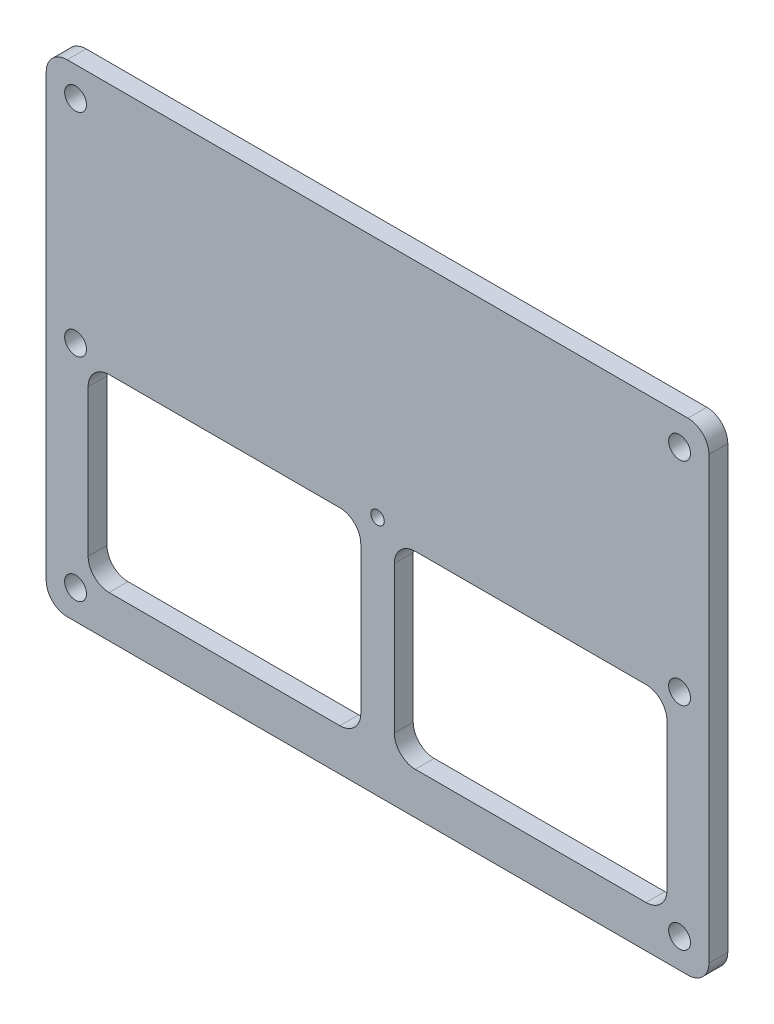
ISO-10303-21;
HEADER;
FILE_DESCRIPTION(('STEP AP214'),'2;1');
FILE_NAME('part.step','',(''),(''),'','','');
FILE_SCHEMA(('AUTOMOTIVE_DESIGN { 1 0 10303 214 1 1 1 1 }'));
ENDSEC;
DATA;
#1=APPLICATION_CONTEXT('core data for automotive mechanical design processes');
#2=APPLICATION_PROTOCOL_DEFINITION('international standard','automotive_design',2000,#1);
#3=PRODUCT_CONTEXT('',#1,'mechanical');
#4=PRODUCT('Part','Part','',(#3));
#5=PRODUCT_RELATED_PRODUCT_CATEGORY('part','',(#4));
#6=PRODUCT_DEFINITION_FORMATION('','',#4);
#7=PRODUCT_DEFINITION_CONTEXT('part definition',#1,'design');
#8=PRODUCT_DEFINITION('design','',#6,#7);
#9=PRODUCT_DEFINITION_SHAPE('','',#8);
#10=(LENGTH_UNIT() NAMED_UNIT(*) SI_UNIT(.MILLI.,.METRE.));
#11=(NAMED_UNIT(*) PLANE_ANGLE_UNIT() SI_UNIT($,.RADIAN.));
#12=(NAMED_UNIT(*) SI_UNIT($,.STERADIAN.) SOLID_ANGLE_UNIT());
#13=UNCERTAINTY_MEASURE_WITH_UNIT(LENGTH_MEASURE(1.E-05),#10,'distance_accuracy_value','');
#14=(GEOMETRIC_REPRESENTATION_CONTEXT(3) GLOBAL_UNCERTAINTY_ASSIGNED_CONTEXT((#13)) GLOBAL_UNIT_ASSIGNED_CONTEXT((#10,
#11,#12)) REPRESENTATION_CONTEXT('',''));
#15=CARTESIAN_POINT('',(0.,0.,0.));
#16=DIRECTION('',(0.,0.,1.));
#17=DIRECTION('',(1.,0.,0.));
#18=AXIS2_PLACEMENT_3D('',#15,#16,#17);
#19=CARTESIAN_POINT('',(-79.,-57.5,4.5));
#20=DIRECTION('',(1.,0.,0.));
#21=DIRECTION('',(0.,0.,-1.));
#22=AXIS2_PLACEMENT_3D('',#19,#20,#21);
#23=PLANE('',#22);
#24=DIRECTION('',(0.,-1.,0.));
#25=VECTOR('',#24,1.);
#26=CARTESIAN_POINT('',(-79.,-57.5,0.));
#27=LINE('',#26,#25);
#28=CARTESIAN_POINT('',(-79.,52.5,0.));
#29=VERTEX_POINT('',#28);
#30=CARTESIAN_POINT('',(-79.,-52.5,0.));
#31=VERTEX_POINT('',#30);
#32=EDGE_CURVE('E346',#29,#31,#27,.T.);
#33=ORIENTED_EDGE('',*,*,#32,.T.);
#34=DIRECTION('',(0.,0.,-1.));
#35=VECTOR('',#34,1.);
#36=CARTESIAN_POINT('',(-79.,-52.5,4.5));
#37=LINE('',#36,#35);
#38=CARTESIAN_POINT('',(-79.,-52.5,4.5));
#39=VERTEX_POINT('',#38);
#40=EDGE_CURVE('E409',#31,#39,#37,.F.);
#41=ORIENTED_EDGE('',*,*,#40,.T.);
#42=DIRECTION('',(0.,-1.,0.));
#43=VECTOR('',#42,1.);
#44=CARTESIAN_POINT('',(-79.,-57.5,4.5));
#45=LINE('',#44,#43);
#46=CARTESIAN_POINT('',(-79.,52.5,4.5));
#47=VERTEX_POINT('',#46);
#48=EDGE_CURVE('E361',#47,#39,#45,.T.);
#49=ORIENTED_EDGE('',*,*,#48,.F.);
#50=DIRECTION('',(0.,0.,-1.));
#51=VECTOR('',#50,1.);
#52=CARTESIAN_POINT('',(-79.,52.5,4.5));
#53=LINE('',#52,#51);
#54=EDGE_CURVE('E406',#47,#29,#53,.T.);
#55=ORIENTED_EDGE('',*,*,#54,.T.);
#56=EDGE_LOOP('',(#33,#41,#49,#55));
#57=FACE_BOUND('',#56,.T.);
#58=ADVANCED_FACE('F37',(#57),#23,.F.);
#59=CARTESIAN_POINT('',(79.,-57.5,4.5));
#60=DIRECTION('',(0.,1.,0.));
#61=DIRECTION('',(-1.,0.,0.));
#62=AXIS2_PLACEMENT_3D('',#59,#60,#61);
#63=PLANE('',#62);
#64=DIRECTION('',(1.,0.,0.));
#65=VECTOR('',#64,1.);
#66=CARTESIAN_POINT('',(79.,-57.5,0.));
#67=LINE('',#66,#65);
#68=CARTESIAN_POINT('',(-74.,-57.5,0.));
#69=VERTEX_POINT('',#68);
#70=CARTESIAN_POINT('',(74.,-57.5,0.));
#71=VERTEX_POINT('',#70);
#72=EDGE_CURVE('E375',#69,#71,#67,.T.);
#73=ORIENTED_EDGE('',*,*,#72,.T.);
#74=DIRECTION('',(0.,0.,-1.));
#75=VECTOR('',#74,1.);
#76=CARTESIAN_POINT('',(74.,-57.5,4.5));
#77=LINE('',#76,#75);
#78=CARTESIAN_POINT('',(74.,-57.5,4.5));
#79=VERTEX_POINT('',#78);
#80=EDGE_CURVE('E397',#71,#79,#77,.F.);
#81=ORIENTED_EDGE('',*,*,#80,.T.);
#82=DIRECTION('',(1.,0.,0.));
#83=VECTOR('',#82,1.);
#84=CARTESIAN_POINT('',(79.,-57.5,4.5));
#85=LINE('',#84,#83);
#86=CARTESIAN_POINT('',(-74.,-57.5,4.5));
#87=VERTEX_POINT('',#86);
#88=EDGE_CURVE('E364',#87,#79,#85,.T.);
#89=ORIENTED_EDGE('',*,*,#88,.F.);
#90=DIRECTION('',(0.,0.,-1.));
#91=VECTOR('',#90,1.);
#92=CARTESIAN_POINT('',(-74.,-57.5,4.5));
#93=LINE('',#92,#91);
#94=EDGE_CURVE('E394',#87,#69,#93,.T.);
#95=ORIENTED_EDGE('',*,*,#94,.T.);
#96=EDGE_LOOP('',(#73,#81,#89,#95));
#97=FACE_BOUND('',#96,.T.);
#98=ADVANCED_FACE('F424',(#97),#63,.F.);
#99=CARTESIAN_POINT('',(79.,-57.5,4.5));
#100=DIRECTION('',(-1.,0.,0.));
#101=DIRECTION('',(0.,0.,1.));
#102=AXIS2_PLACEMENT_3D('',#99,#100,#101);
#103=PLANE('',#102);
#104=DIRECTION('',(0.,1.,0.));
#105=VECTOR('',#104,1.);
#106=CARTESIAN_POINT('',(79.,-57.5,4.5));
#107=LINE('',#106,#105);
#108=CARTESIAN_POINT('',(79.,-52.5,4.5));
#109=VERTEX_POINT('',#108);
#110=CARTESIAN_POINT('',(79.,52.5,4.5));
#111=VERTEX_POINT('',#110);
#112=EDGE_CURVE('E368',#109,#111,#107,.T.);
#113=ORIENTED_EDGE('',*,*,#112,.F.);
#114=DIRECTION('',(0.,0.,-1.));
#115=VECTOR('',#114,1.);
#116=CARTESIAN_POINT('',(79.,-52.5,4.5));
#117=LINE('',#116,#115);
#118=CARTESIAN_POINT('',(79.,-52.5,0.));
#119=VERTEX_POINT('',#118);
#120=EDGE_CURVE('E383',#109,#119,#117,.T.);
#121=ORIENTED_EDGE('',*,*,#120,.T.);
#122=DIRECTION('',(0.,1.,0.));
#123=VECTOR('',#122,1.);
#124=CARTESIAN_POINT('',(79.,-57.5,0.));
#125=LINE('',#124,#123);
#126=CARTESIAN_POINT('',(79.,52.5,0.));
#127=VERTEX_POINT('',#126);
#128=EDGE_CURVE('E378',#119,#127,#125,.T.);
#129=ORIENTED_EDGE('',*,*,#128,.T.);
#130=DIRECTION('',(0.,0.,-1.));
#131=VECTOR('',#130,1.);
#132=CARTESIAN_POINT('',(79.,52.5,4.5));
#133=LINE('',#132,#131);
#134=EDGE_CURVE('E372',#127,#111,#133,.F.);
#135=ORIENTED_EDGE('',*,*,#134,.T.);
#136=EDGE_LOOP('',(#113,#121,#129,#135));
#137=FACE_BOUND('',#136,.T.);
#138=ADVANCED_FACE('F434',(#137),#103,.F.);
#139=CARTESIAN_POINT('',(79.,57.5,4.5));
#140=DIRECTION('',(0.,-1.,0.));
#141=DIRECTION('',(1.,0.,0.));
#142=AXIS2_PLACEMENT_3D('',#139,#140,#141);
#143=PLANE('',#142);
#144=DIRECTION('',(-1.,0.,0.));
#145=VECTOR('',#144,1.);
#146=CARTESIAN_POINT('',(79.,57.5,4.5));
#147=LINE('',#146,#145);
#148=CARTESIAN_POINT('',(74.,57.5,4.5));
#149=VERTEX_POINT('',#148);
#150=CARTESIAN_POINT('',(-74.,57.5,4.5));
#151=VERTEX_POINT('',#150);
#152=EDGE_CURVE('E370',#149,#151,#147,.T.);
#153=ORIENTED_EDGE('',*,*,#152,.F.);
#154=DIRECTION('',(0.,0.,-1.));
#155=VECTOR('',#154,1.);
#156=CARTESIAN_POINT('',(74.,57.5,4.5));
#157=LINE('',#156,#155);
#158=CARTESIAN_POINT('',(74.,57.5,0.));
#159=VERTEX_POINT('',#158);
#160=EDGE_CURVE('E11',#149,#159,#157,.T.);
#161=ORIENTED_EDGE('',*,*,#160,.T.);
#162=DIRECTION('',(-1.,0.,0.));
#163=VECTOR('',#162,1.);
#164=CARTESIAN_POINT('',(79.,57.5,0.));
#165=LINE('',#164,#163);
#166=CARTESIAN_POINT('',(-74.,57.5,0.));
#167=VERTEX_POINT('',#166);
#168=EDGE_CURVE('E365',#159,#167,#165,.T.);
#169=ORIENTED_EDGE('',*,*,#168,.T.);
#170=DIRECTION('',(0.,0.,-1.));
#171=VECTOR('',#170,1.);
#172=CARTESIAN_POINT('',(-74.,57.5,4.5));
#173=LINE('',#172,#171);
#174=EDGE_CURVE('E45',#167,#151,#173,.F.);
#175=ORIENTED_EDGE('',*,*,#174,.T.);
#176=EDGE_LOOP('',(#153,#161,#169,#175));
#177=FACE_BOUND('',#176,.T.);
#178=ADVANCED_FACE('F440',(#177),#143,.F.);
#179=CARTESIAN_POINT('',(0.,0.,4.5));
#180=DIRECTION('',(0.,0.,1.));
#181=DIRECTION('',(1.,0.,0.));
#182=AXIS2_PLACEMENT_3D('',#179,#180,#181);
#183=PLANE('',#182);
#184=CARTESIAN_POINT('',(64.,-7.49999999999999,4.5));
#185=DIRECTION('',(0.,0.,1.));
#186=DIRECTION('',(-1.,0.,0.));
#187=AXIS2_PLACEMENT_3D('',#184,#185,#186);
#188=CIRCLE('',#187,5.);
#189=CARTESIAN_POINT('',(69.,-7.49999999999999,4.5));
#190=VERTEX_POINT('',#189);
#191=CARTESIAN_POINT('',(64.,-2.49999999999999,4.5));
#192=VERTEX_POINT('',#191);
#193=EDGE_CURVE('E206',#190,#192,#188,.T.);
#194=ORIENTED_EDGE('',*,*,#193,.F.);
#195=DIRECTION('',(0.,1.,0.));
#196=VECTOR('',#195,1.);
#197=CARTESIAN_POINT('',(69.,-7.49999999999999,4.5));
#198=LINE('',#197,#196);
#199=CARTESIAN_POINT('',(69.,-42.5,4.5));
#200=VERTEX_POINT('',#199);
#201=EDGE_CURVE('E225',#200,#190,#198,.T.);
#202=ORIENTED_EDGE('',*,*,#201,.F.);
#203=CARTESIAN_POINT('',(64.,-42.5,4.5));
#204=DIRECTION('',(0.,0.,1.));
#205=DIRECTION('',(-1.,0.,0.));
#206=AXIS2_PLACEMENT_3D('',#203,#204,#205);
#207=CIRCLE('',#206,5.00000000000001);
#208=CARTESIAN_POINT('',(64.,-47.5,4.5));
#209=VERTEX_POINT('',#208);
#210=EDGE_CURVE('E228',#209,#200,#207,.T.);
#211=ORIENTED_EDGE('',*,*,#210,.F.);
#212=DIRECTION('',(1.,0.,0.));
#213=VECTOR('',#212,1.);
#214=CARTESIAN_POINT('',(64.,-47.5,4.5));
#215=LINE('',#214,#213);
#216=CARTESIAN_POINT('',(9.00000000000006,-47.5,4.5));
#217=VERTEX_POINT('',#216);
#218=EDGE_CURVE('E260',#217,#209,#215,.T.);
#219=ORIENTED_EDGE('',*,*,#218,.F.);
#220=CARTESIAN_POINT('',(9.00000000000005,-42.5,4.5));
#221=DIRECTION('',(0.,0.,1.));
#222=DIRECTION('',(-1.,0.,0.));
#223=AXIS2_PLACEMENT_3D('',#220,#221,#222);
#224=CIRCLE('',#223,5.);
#225=CARTESIAN_POINT('',(4.00000000000005,-42.5,4.5));
#226=VERTEX_POINT('',#225);
#227=EDGE_CURVE('E257',#226,#217,#224,.T.);
#228=ORIENTED_EDGE('',*,*,#227,.F.);
#229=DIRECTION('',(0.,-1.,0.));
#230=VECTOR('',#229,1.);
#231=CARTESIAN_POINT('',(4.00000000000004,-7.50000000000001,4.5));
#232=LINE('',#231,#230);
#233=CARTESIAN_POINT('',(4.00000000000004,-7.50000000000001,4.5));
#234=VERTEX_POINT('',#233);
#235=EDGE_CURVE('E254',#234,#226,#232,.T.);
#236=ORIENTED_EDGE('',*,*,#235,.F.);
#237=CARTESIAN_POINT('',(9.00000000000004,-7.50000000000001,4.5));
#238=DIRECTION('',(0.,0.,1.));
#239=DIRECTION('',(1.,0.,0.));
#240=AXIS2_PLACEMENT_3D('',#237,#238,#239);
#241=CIRCLE('',#240,5.);
#242=CARTESIAN_POINT('',(9.00000000000004,-2.50000000000001,4.5));
#243=VERTEX_POINT('',#242);
#244=EDGE_CURVE('E251',#243,#234,#241,.T.);
#245=ORIENTED_EDGE('',*,*,#244,.F.);
#246=DIRECTION('',(-1.,0.,0.));
#247=VECTOR('',#246,1.);
#248=CARTESIAN_POINT('',(64.,-2.49999999999999,4.5));
#249=LINE('',#248,#247);
#250=EDGE_CURVE('E248',#192,#243,#249,.T.);
#251=ORIENTED_EDGE('',*,*,#250,.F.);
#252=EDGE_LOOP('',(#194,#202,#211,#219,#228,#236,#245,#251));
#253=FACE_BOUND('',#252,.T.);
#254=CARTESIAN_POINT('',(-72.,50.5,4.5));
#255=DIRECTION('',(0.,0.,1.));
#256=DIRECTION('',(1.,0.,0.));
#257=AXIS2_PLACEMENT_3D('',#254,#255,#256);
#258=CIRCLE('',#257,2.6);
#259=CARTESIAN_POINT('',(-69.4,50.5,4.5));
#260=VERTEX_POINT('',#259);
#261=EDGE_CURVE('E281',#260,#260,#258,.T.);
#262=ORIENTED_EDGE('',*,*,#261,.F.);
#263=EDGE_LOOP('',(#262));
#264=FACE_BOUND('',#263,.T.);
#265=CARTESIAN_POINT('',(72.,50.5,4.5));
#266=DIRECTION('',(0.,0.,1.));
#267=DIRECTION('',(1.,0.,0.));
#268=AXIS2_PLACEMENT_3D('',#265,#266,#267);
#269=CIRCLE('',#268,2.6);
#270=CARTESIAN_POINT('',(74.6,50.5,4.5));
#271=VERTEX_POINT('',#270);
#272=EDGE_CURVE('E287',#271,#271,#269,.T.);
#273=ORIENTED_EDGE('',*,*,#272,.F.);
#274=EDGE_LOOP('',(#273));
#275=FACE_BOUND('',#274,.T.);
#276=CARTESIAN_POINT('',(72.,0.,4.5));
#277=DIRECTION('',(0.,0.,1.));
#278=DIRECTION('',(1.,0.,0.));
#279=AXIS2_PLACEMENT_3D('',#276,#277,#278);
#280=CIRCLE('',#279,2.6);
#281=CARTESIAN_POINT('',(74.6,0.,4.5));
#282=VERTEX_POINT('',#281);
#283=EDGE_CURVE('E293',#282,#282,#280,.T.);
#284=ORIENTED_EDGE('',*,*,#283,.F.);
#285=EDGE_LOOP('',(#284));
#286=FACE_BOUND('',#285,.T.);
#287=CARTESIAN_POINT('',(72.,-50.5,4.5));
#288=DIRECTION('',(0.,0.,1.));
#289=DIRECTION('',(1.,0.,0.));
#290=AXIS2_PLACEMENT_3D('',#287,#288,#289);
#291=CIRCLE('',#290,2.6);
#292=CARTESIAN_POINT('',(74.6,-50.5,4.5));
#293=VERTEX_POINT('',#292);
#294=EDGE_CURVE('E758',#293,#293,#291,.T.);
#295=ORIENTED_EDGE('',*,*,#294,.F.);
#296=EDGE_LOOP('',(#295));
#297=FACE_BOUND('',#296,.T.);
#298=CARTESIAN_POINT('',(-72.,-50.5,4.5));
#299=DIRECTION('',(0.,0.,1.));
#300=DIRECTION('',(1.,0.,0.));
#301=AXIS2_PLACEMENT_3D('',#298,#299,#300);
#302=CIRCLE('',#301,2.6);
#303=CARTESIAN_POINT('',(-69.4,-50.5,4.5));
#304=VERTEX_POINT('',#303);
#305=EDGE_CURVE('E762',#304,#304,#302,.T.);
#306=ORIENTED_EDGE('',*,*,#305,.F.);
#307=EDGE_LOOP('',(#306));
#308=FACE_BOUND('',#307,.T.);
#309=CARTESIAN_POINT('',(-72.,0.,4.5));
#310=DIRECTION('',(0.,0.,1.));
#311=DIRECTION('',(1.,0.,0.));
#312=AXIS2_PLACEMENT_3D('',#309,#310,#311);
#313=CIRCLE('',#312,2.6);
#314=CARTESIAN_POINT('',(-69.4,0.,4.5));
#315=VERTEX_POINT('',#314);
#316=EDGE_CURVE('E766',#315,#315,#313,.T.);
#317=ORIENTED_EDGE('',*,*,#316,.F.);
#318=EDGE_LOOP('',(#317));
#319=FACE_BOUND('',#318,.T.);
#320=CARTESIAN_POINT('',(0.,0.,4.5));
#321=DIRECTION('',(0.,0.,1.));
#322=DIRECTION('',(1.,0.,0.));
#323=AXIS2_PLACEMENT_3D('',#320,#321,#322);
#324=CIRCLE('',#323,1.6);
#325=CARTESIAN_POINT('',(1.60000000000001,0.,4.5));
#326=VERTEX_POINT('',#325);
#327=EDGE_CURVE('E231',#326,#326,#324,.T.);
#328=ORIENTED_EDGE('',*,*,#327,.F.);
#329=EDGE_LOOP('',(#328));
#330=FACE_BOUND('',#329,.T.);
#331=CARTESIAN_POINT('',(-64.,-42.5,4.5));
#332=DIRECTION('',(0.,0.,1.));
#333=DIRECTION('',(1.,0.,0.));
#334=AXIS2_PLACEMENT_3D('',#331,#332,#333);
#335=CIRCLE('',#334,5.00000000000001);
#336=CARTESIAN_POINT('',(-69.,-42.5,4.5));
#337=VERTEX_POINT('',#336);
#338=CARTESIAN_POINT('',(-64.,-47.5,4.5));
#339=VERTEX_POINT('',#338);
#340=EDGE_CURVE('E267',#337,#339,#335,.T.);
#341=ORIENTED_EDGE('',*,*,#340,.F.);
#342=DIRECTION('',(0.,-1.,0.));
#343=VECTOR('',#342,1.);
#344=CARTESIAN_POINT('',(-69.,-7.50000000000001,4.5));
#345=LINE('',#344,#343);
#346=CARTESIAN_POINT('',(-69.,-7.50000000000001,4.5));
#347=VERTEX_POINT('',#346);
#348=EDGE_CURVE('E301',#347,#337,#345,.T.);
#349=ORIENTED_EDGE('',*,*,#348,.F.);
#350=CARTESIAN_POINT('',(-64.,-7.50000000000001,4.5));
#351=DIRECTION('',(0.,0.,1.));
#352=DIRECTION('',(1.,0.,0.));
#353=AXIS2_PLACEMENT_3D('',#350,#351,#352);
#354=CIRCLE('',#353,5.);
#355=CARTESIAN_POINT('',(-64.,-2.50000000000001,4.5));
#356=VERTEX_POINT('',#355);
#357=EDGE_CURVE('E339',#356,#347,#354,.T.);
#358=ORIENTED_EDGE('',*,*,#357,.F.);
#359=DIRECTION('',(-1.,0.,0.));
#360=VECTOR('',#359,1.);
#361=CARTESIAN_POINT('',(-64.,-2.50000000000001,4.5));
#362=LINE('',#361,#360);
#363=CARTESIAN_POINT('',(-9.00000000000002,-2.50000000000001,4.5));
#364=VERTEX_POINT('',#363);
#365=EDGE_CURVE('E336',#364,#356,#362,.T.);
#366=ORIENTED_EDGE('',*,*,#365,.F.);
#367=CARTESIAN_POINT('',(-9.00000000000002,-7.50000000000001,4.5));
#368=DIRECTION('',(0.,0.,1.));
#369=DIRECTION('',(-1.,0.,0.));
#370=AXIS2_PLACEMENT_3D('',#367,#368,#369);
#371=CIRCLE('',#370,5.);
#372=CARTESIAN_POINT('',(-4.00000000000002,-7.50000000000001,4.5));
#373=VERTEX_POINT('',#372);
#374=EDGE_CURVE('E333',#373,#364,#371,.T.);
#375=ORIENTED_EDGE('',*,*,#374,.F.);
#376=DIRECTION('',(0.,1.,0.));
#377=VECTOR('',#376,1.);
#378=CARTESIAN_POINT('',(-4.00000000000002,-7.50000000000001,4.5));
#379=LINE('',#378,#377);
#380=CARTESIAN_POINT('',(-4.00000000000002,-42.5,4.5));
#381=VERTEX_POINT('',#380);
#382=EDGE_CURVE('E330',#381,#373,#379,.T.);
#383=ORIENTED_EDGE('',*,*,#382,.F.);
#384=CARTESIAN_POINT('',(-9.00000000000003,-42.5,4.5));
#385=DIRECTION('',(0.,0.,1.));
#386=DIRECTION('',(1.,0.,0.));
#387=AXIS2_PLACEMENT_3D('',#384,#385,#386);
#388=CIRCLE('',#387,5.00000000000001);
#389=CARTESIAN_POINT('',(-9.00000000000003,-47.5,4.5));
#390=VERTEX_POINT('',#389);
#391=EDGE_CURVE('E327',#390,#381,#388,.T.);
#392=ORIENTED_EDGE('',*,*,#391,.F.);
#393=DIRECTION('',(1.,0.,0.));
#394=VECTOR('',#393,1.);
#395=CARTESIAN_POINT('',(-64.,-47.5,4.5));
#396=LINE('',#395,#394);
#397=EDGE_CURVE('E324',#339,#390,#396,.T.);
#398=ORIENTED_EDGE('',*,*,#397,.F.);
#399=EDGE_LOOP('',(#341,#349,#358,#366,#375,#383,#392,#398));
#400=FACE_BOUND('',#399,.T.);
#401=ORIENTED_EDGE('',*,*,#88,.T.);
#402=CARTESIAN_POINT('',(74.,-52.5,4.5));
#403=DIRECTION('',(0.,0.,1.));
#404=DIRECTION('',(1.,0.,0.));
#405=AXIS2_PLACEMENT_3D('',#402,#403,#404);
#406=CIRCLE('',#405,5.);
#407=EDGE_CURVE('E404',#79,#109,#406,.T.);
#408=ORIENTED_EDGE('',*,*,#407,.T.);
#409=ORIENTED_EDGE('',*,*,#112,.T.);
#410=CARTESIAN_POINT('',(74.,52.5,4.5));
#411=DIRECTION('',(0.,0.,1.));
#412=DIRECTION('',(1.,0.,0.));
#413=AXIS2_PLACEMENT_3D('',#410,#411,#412);
#414=CIRCLE('',#413,5.);
#415=EDGE_CURVE('E58',#111,#149,#414,.T.);
#416=ORIENTED_EDGE('',*,*,#415,.T.);
#417=ORIENTED_EDGE('',*,*,#152,.T.);
#418=CARTESIAN_POINT('',(-74.,52.5,4.5));
#419=DIRECTION('',(0.,0.,1.));
#420=DIRECTION('',(1.,0.,0.));
#421=AXIS2_PLACEMENT_3D('',#418,#419,#420);
#422=CIRCLE('',#421,5.);
#423=EDGE_CURVE('E399',#151,#47,#422,.T.);
#424=ORIENTED_EDGE('',*,*,#423,.T.);
#425=ORIENTED_EDGE('',*,*,#48,.T.);
#426=CARTESIAN_POINT('',(-74.,-52.5,4.5));
#427=DIRECTION('',(0.,0.,1.));
#428=DIRECTION('',(1.,0.,0.));
#429=AXIS2_PLACEMENT_3D('',#426,#427,#428);
#430=CIRCLE('',#429,5.);
#431=EDGE_CURVE('E402',#39,#87,#430,.T.);
#432=ORIENTED_EDGE('',*,*,#431,.T.);
#433=EDGE_LOOP('',(#401,#408,#409,#416,#417,#424,#425,#432));
#434=FACE_BOUND('',#433,.T.);
#435=ADVANCED_FACE('F417',(#253,#264,#275,#286,#297,#308,#319,#330,#400,#434),#183,.T.);
#436=CARTESIAN_POINT('',(0.,0.,0.));
#437=DIRECTION('',(0.,0.,1.));
#438=DIRECTION('',(1.,0.,0.));
#439=AXIS2_PLACEMENT_3D('',#436,#437,#438);
#440=PLANE('',#439);
#441=DIRECTION('',(0.,1.,0.));
#442=VECTOR('',#441,1.);
#443=CARTESIAN_POINT('',(69.,-7.49999999999999,0.));
#444=LINE('',#443,#442);
#445=CARTESIAN_POINT('',(69.,-42.5,0.));
#446=VERTEX_POINT('',#445);
#447=CARTESIAN_POINT('',(69.,-7.49999999999999,0.));
#448=VERTEX_POINT('',#447);
#449=EDGE_CURVE('E211',#446,#448,#444,.T.);
#450=ORIENTED_EDGE('',*,*,#449,.T.);
#451=CARTESIAN_POINT('',(64.,-7.49999999999999,0.));
#452=DIRECTION('',(0.,0.,1.));
#453=DIRECTION('',(-1.,0.,0.));
#454=AXIS2_PLACEMENT_3D('',#451,#452,#453);
#455=CIRCLE('',#454,5.);
#456=CARTESIAN_POINT('',(64.,-2.49999999999999,0.));
#457=VERTEX_POINT('',#456);
#458=EDGE_CURVE('E203',#448,#457,#455,.T.);
#459=ORIENTED_EDGE('',*,*,#458,.T.);
#460=DIRECTION('',(-1.,0.,0.));
#461=VECTOR('',#460,1.);
#462=CARTESIAN_POINT('',(64.,-2.49999999999999,0.));
#463=LINE('',#462,#461);
#464=CARTESIAN_POINT('',(9.00000000000004,-2.50000000000001,0.));
#465=VERTEX_POINT('',#464);
#466=EDGE_CURVE('E215',#457,#465,#463,.T.);
#467=ORIENTED_EDGE('',*,*,#466,.T.);
#468=CARTESIAN_POINT('',(9.00000000000004,-7.50000000000001,0.));
#469=DIRECTION('',(0.,0.,1.));
#470=DIRECTION('',(1.,0.,0.));
#471=AXIS2_PLACEMENT_3D('',#468,#469,#470);
#472=CIRCLE('',#471,5.);
#473=CARTESIAN_POINT('',(4.00000000000004,-7.50000000000001,0.));
#474=VERTEX_POINT('',#473);
#475=EDGE_CURVE('E219',#465,#474,#472,.T.);
#476=ORIENTED_EDGE('',*,*,#475,.T.);
#477=DIRECTION('',(0.,-1.,0.));
#478=VECTOR('',#477,1.);
#479=CARTESIAN_POINT('',(4.00000000000004,-7.50000000000001,0.));
#480=LINE('',#479,#478);
#481=CARTESIAN_POINT('',(4.00000000000005,-42.5,0.));
#482=VERTEX_POINT('',#481);
#483=EDGE_CURVE('E235',#474,#482,#480,.T.);
#484=ORIENTED_EDGE('',*,*,#483,.T.);
#485=CARTESIAN_POINT('',(9.00000000000005,-42.5,0.));
#486=DIRECTION('',(0.,0.,1.));
#487=DIRECTION('',(-1.,0.,0.));
#488=AXIS2_PLACEMENT_3D('',#485,#486,#487);
#489=CIRCLE('',#488,5.);
#490=CARTESIAN_POINT('',(9.00000000000006,-47.5,0.));
#491=VERTEX_POINT('',#490);
#492=EDGE_CURVE('E238',#482,#491,#489,.T.);
#493=ORIENTED_EDGE('',*,*,#492,.T.);
#494=DIRECTION('',(1.,0.,0.));
#495=VECTOR('',#494,1.);
#496=CARTESIAN_POINT('',(64.,-47.5,0.));
#497=LINE('',#496,#495);
#498=CARTESIAN_POINT('',(64.,-47.5,0.));
#499=VERTEX_POINT('',#498);
#500=EDGE_CURVE('E241',#491,#499,#497,.T.);
#501=ORIENTED_EDGE('',*,*,#500,.T.);
#502=CARTESIAN_POINT('',(64.,-42.5,0.));
#503=DIRECTION('',(0.,0.,1.));
#504=DIRECTION('',(-1.,0.,0.));
#505=AXIS2_PLACEMENT_3D('',#502,#503,#504);
#506=CIRCLE('',#505,5.00000000000001);
#507=EDGE_CURVE('E244',#499,#446,#506,.T.);
#508=ORIENTED_EDGE('',*,*,#507,.T.);
#509=EDGE_LOOP('',(#450,#459,#467,#476,#484,#493,#501,#508));
#510=FACE_BOUND('',#509,.T.);
#511=CARTESIAN_POINT('',(-72.,50.5,0.));
#512=DIRECTION('',(0.,0.,1.));
#513=DIRECTION('',(1.,0.,0.));
#514=AXIS2_PLACEMENT_3D('',#511,#512,#513);
#515=CIRCLE('',#514,2.6);
#516=CARTESIAN_POINT('',(-69.4,50.5,0.));
#517=VERTEX_POINT('',#516);
#518=EDGE_CURVE('E249',#517,#517,#515,.T.);
#519=ORIENTED_EDGE('',*,*,#518,.T.);
#520=EDGE_LOOP('',(#519));
#521=FACE_BOUND('',#520,.T.);
#522=CARTESIAN_POINT('',(72.,50.5,0.));
#523=DIRECTION('',(0.,0.,1.));
#524=DIRECTION('',(1.,0.,0.));
#525=AXIS2_PLACEMENT_3D('',#522,#523,#524);
#526=CIRCLE('',#525,2.6);
#527=CARTESIAN_POINT('',(74.6,50.5,0.));
#528=VERTEX_POINT('',#527);
#529=EDGE_CURVE('E284',#528,#528,#526,.T.);
#530=ORIENTED_EDGE('',*,*,#529,.T.);
#531=EDGE_LOOP('',(#530));
#532=FACE_BOUND('',#531,.T.);
#533=CARTESIAN_POINT('',(72.,0.,0.));
#534=DIRECTION('',(0.,0.,1.));
#535=DIRECTION('',(1.,0.,0.));
#536=AXIS2_PLACEMENT_3D('',#533,#534,#535);
#537=CIRCLE('',#536,2.6);
#538=CARTESIAN_POINT('',(74.6,0.,0.));
#539=VERTEX_POINT('',#538);
#540=EDGE_CURVE('E290',#539,#539,#537,.T.);
#541=ORIENTED_EDGE('',*,*,#540,.T.);
#542=EDGE_LOOP('',(#541));
#543=FACE_BOUND('',#542,.T.);
#544=CARTESIAN_POINT('',(72.,-50.5,0.));
#545=DIRECTION('',(0.,0.,1.));
#546=DIRECTION('',(1.,0.,0.));
#547=AXIS2_PLACEMENT_3D('',#544,#545,#546);
#548=CIRCLE('',#547,2.6);
#549=CARTESIAN_POINT('',(74.6,-50.5,0.));
#550=VERTEX_POINT('',#549);
#551=EDGE_CURVE('E296',#550,#550,#548,.T.);
#552=ORIENTED_EDGE('',*,*,#551,.T.);
#553=EDGE_LOOP('',(#552));
#554=FACE_BOUND('',#553,.T.);
#555=CARTESIAN_POINT('',(-72.,-50.5,0.));
#556=DIRECTION('',(0.,0.,1.));
#557=DIRECTION('',(1.,0.,0.));
#558=AXIS2_PLACEMENT_3D('',#555,#556,#557);
#559=CIRCLE('',#558,2.6);
#560=CARTESIAN_POINT('',(-69.4,-50.5,0.));
#561=VERTEX_POINT('',#560);
#562=EDGE_CURVE('E798',#561,#561,#559,.T.);
#563=ORIENTED_EDGE('',*,*,#562,.T.);
#564=EDGE_LOOP('',(#563));
#565=FACE_BOUND('',#564,.T.);
#566=CARTESIAN_POINT('',(-72.,0.,0.));
#567=DIRECTION('',(0.,0.,1.));
#568=DIRECTION('',(1.,0.,0.));
#569=AXIS2_PLACEMENT_3D('',#566,#567,#568);
#570=CIRCLE('',#569,2.6);
#571=CARTESIAN_POINT('',(-69.4,0.,0.));
#572=VERTEX_POINT('',#571);
#573=EDGE_CURVE('E792',#572,#572,#570,.T.);
#574=ORIENTED_EDGE('',*,*,#573,.T.);
#575=EDGE_LOOP('',(#574));
#576=FACE_BOUND('',#575,.T.);
#577=CARTESIAN_POINT('',(0.,0.,0.));
#578=DIRECTION('',(0.,0.,1.));
#579=DIRECTION('',(1.,0.,0.));
#580=AXIS2_PLACEMENT_3D('',#577,#578,#579);
#581=CIRCLE('',#580,1.6);
#582=CARTESIAN_POINT('',(1.60000000000001,0.,0.));
#583=VERTEX_POINT('',#582);
#584=EDGE_CURVE('E788',#583,#583,#581,.T.);
#585=ORIENTED_EDGE('',*,*,#584,.T.);
#586=EDGE_LOOP('',(#585));
#587=FACE_BOUND('',#586,.T.);
#588=DIRECTION('',(0.,-1.,0.));
#589=VECTOR('',#588,1.);
#590=CARTESIAN_POINT('',(-69.,-7.50000000000001,0.));
#591=LINE('',#590,#589);
#592=CARTESIAN_POINT('',(-69.,-7.50000000000001,0.));
#593=VERTEX_POINT('',#592);
#594=CARTESIAN_POINT('',(-69.,-42.5,0.));
#595=VERTEX_POINT('',#594);
#596=EDGE_CURVE('E319',#593,#595,#591,.T.);
#597=ORIENTED_EDGE('',*,*,#596,.T.);
#598=CARTESIAN_POINT('',(-64.,-42.5,0.));
#599=DIRECTION('',(0.,0.,1.));
#600=DIRECTION('',(1.,0.,0.));
#601=AXIS2_PLACEMENT_3D('',#598,#599,#600);
#602=CIRCLE('',#601,5.00000000000001);
#603=CARTESIAN_POINT('',(-64.,-47.5,0.));
#604=VERTEX_POINT('',#603);
#605=EDGE_CURVE('E297',#595,#604,#602,.T.);
#606=ORIENTED_EDGE('',*,*,#605,.T.);
#607=DIRECTION('',(1.,0.,0.));
#608=VECTOR('',#607,1.);
#609=CARTESIAN_POINT('',(-64.,-47.5,0.));
#610=LINE('',#609,#608);
#611=CARTESIAN_POINT('',(-9.00000000000003,-47.5,0.));
#612=VERTEX_POINT('',#611);
#613=EDGE_CURVE('E300',#604,#612,#610,.T.);
#614=ORIENTED_EDGE('',*,*,#613,.T.);
#615=CARTESIAN_POINT('',(-9.00000000000003,-42.5,0.));
#616=DIRECTION('',(0.,0.,1.));
#617=DIRECTION('',(1.,0.,0.));
#618=AXIS2_PLACEMENT_3D('',#615,#616,#617);
#619=CIRCLE('',#618,5.00000000000001);
#620=CARTESIAN_POINT('',(-4.00000000000002,-42.5,0.));
#621=VERTEX_POINT('',#620);
#622=EDGE_CURVE('E304',#612,#621,#619,.T.);
#623=ORIENTED_EDGE('',*,*,#622,.T.);
#624=DIRECTION('',(0.,1.,0.));
#625=VECTOR('',#624,1.);
#626=CARTESIAN_POINT('',(-4.00000000000002,-7.50000000000001,0.));
#627=LINE('',#626,#625);
#628=CARTESIAN_POINT('',(-4.00000000000002,-7.50000000000001,0.));
#629=VERTEX_POINT('',#628);
#630=EDGE_CURVE('E307',#621,#629,#627,.T.);
#631=ORIENTED_EDGE('',*,*,#630,.T.);
#632=CARTESIAN_POINT('',(-9.00000000000002,-7.50000000000001,0.));
#633=DIRECTION('',(0.,0.,1.));
#634=DIRECTION('',(-1.,0.,0.));
#635=AXIS2_PLACEMENT_3D('',#632,#633,#634);
#636=CIRCLE('',#635,5.);
#637=CARTESIAN_POINT('',(-9.00000000000002,-2.50000000000001,0.));
#638=VERTEX_POINT('',#637);
#639=EDGE_CURVE('E310',#629,#638,#636,.T.);
#640=ORIENTED_EDGE('',*,*,#639,.T.);
#641=DIRECTION('',(-1.,0.,0.));
#642=VECTOR('',#641,1.);
#643=CARTESIAN_POINT('',(-64.,-2.50000000000001,0.));
#644=LINE('',#643,#642);
#645=CARTESIAN_POINT('',(-64.,-2.50000000000001,0.));
#646=VERTEX_POINT('',#645);
#647=EDGE_CURVE('E313',#638,#646,#644,.T.);
#648=ORIENTED_EDGE('',*,*,#647,.T.);
#649=CARTESIAN_POINT('',(-64.,-7.50000000000001,0.));
#650=DIRECTION('',(0.,0.,1.));
#651=DIRECTION('',(1.,0.,0.));
#652=AXIS2_PLACEMENT_3D('',#649,#650,#651);
#653=CIRCLE('',#652,5.);
#654=EDGE_CURVE('E316',#646,#593,#653,.T.);
#655=ORIENTED_EDGE('',*,*,#654,.T.);
#656=EDGE_LOOP('',(#597,#606,#614,#623,#631,#640,#648,#655));
#657=FACE_BOUND('',#656,.T.);
#658=ORIENTED_EDGE('',*,*,#128,.F.);
#659=CARTESIAN_POINT('',(74.,-52.5,0.));
#660=DIRECTION('',(0.,0.,1.));
#661=DIRECTION('',(1.,0.,0.));
#662=AXIS2_PLACEMENT_3D('',#659,#660,#661);
#663=CIRCLE('',#662,5.);
#664=EDGE_CURVE('E392',#119,#71,#663,.F.);
#665=ORIENTED_EDGE('',*,*,#664,.T.);
#666=ORIENTED_EDGE('',*,*,#72,.F.);
#667=CARTESIAN_POINT('',(-74.,-52.5,0.));
#668=DIRECTION('',(0.,0.,1.));
#669=DIRECTION('',(1.,0.,0.));
#670=AXIS2_PLACEMENT_3D('',#667,#668,#669);
#671=CIRCLE('',#670,5.);
#672=EDGE_CURVE('E390',#69,#31,#671,.F.);
#673=ORIENTED_EDGE('',*,*,#672,.T.);
#674=ORIENTED_EDGE('',*,*,#32,.F.);
#675=CARTESIAN_POINT('',(-74.,52.5,0.));
#676=DIRECTION('',(0.,0.,1.));
#677=DIRECTION('',(1.,0.,0.));
#678=AXIS2_PLACEMENT_3D('',#675,#676,#677);
#679=CIRCLE('',#678,5.);
#680=EDGE_CURVE('E386',#29,#167,#679,.F.);
#681=ORIENTED_EDGE('',*,*,#680,.T.);
#682=ORIENTED_EDGE('',*,*,#168,.F.);
#683=CARTESIAN_POINT('',(74.,52.5,0.));
#684=DIRECTION('',(0.,0.,1.));
#685=DIRECTION('',(1.,0.,0.));
#686=AXIS2_PLACEMENT_3D('',#683,#684,#685);
#687=CIRCLE('',#686,5.);
#688=EDGE_CURVE('E388',#159,#127,#687,.F.);
#689=ORIENTED_EDGE('',*,*,#688,.T.);
#690=EDGE_LOOP('',(#658,#665,#666,#673,#674,#681,#682,#689));
#691=FACE_BOUND('',#690,.T.);
#692=ADVANCED_FACE('F221',(#510,#521,#532,#543,#554,#565,#576,#587,#657,#691),#440,.F.);
#693=CARTESIAN_POINT('',(-64.,-42.5,0.));
#694=DIRECTION('',(0.,0.,1.));
#695=DIRECTION('',(1.,0.,0.));
#696=AXIS2_PLACEMENT_3D('',#693,#694,#695);
#697=CYLINDRICAL_SURFACE('',#696,5.00000000000001);
#698=ORIENTED_EDGE('',*,*,#340,.T.);
#699=DIRECTION('',(0.,0.,1.));
#700=VECTOR('',#699,1.);
#701=CARTESIAN_POINT('',(-64.,-47.5,0.));
#702=LINE('',#701,#700);
#703=EDGE_CURVE('E322',#604,#339,#702,.T.);
#704=ORIENTED_EDGE('',*,*,#703,.F.);
#705=ORIENTED_EDGE('',*,*,#605,.F.);
#706=DIRECTION('',(0.,0.,1.));
#707=VECTOR('',#706,1.);
#708=CARTESIAN_POINT('',(-69.,-42.5,0.));
#709=LINE('',#708,#707);
#710=EDGE_CURVE('E344',#595,#337,#709,.T.);
#711=ORIENTED_EDGE('',*,*,#710,.T.);
#712=EDGE_LOOP('',(#698,#704,#705,#711));
#713=FACE_BOUND('',#712,.T.);
#714=ADVANCED_FACE('F672',(#713),#697,.F.);
#715=CARTESIAN_POINT('',(-69.,-7.50000000000001,0.));
#716=DIRECTION('',(-1.,0.,0.));
#717=DIRECTION('',(0.,-1.,0.));
#718=AXIS2_PLACEMENT_3D('',#715,#716,#717);
#719=PLANE('',#718);
#720=ORIENTED_EDGE('',*,*,#348,.T.);
#721=ORIENTED_EDGE('',*,*,#710,.F.);
#722=ORIENTED_EDGE('',*,*,#596,.F.);
#723=DIRECTION('',(0.,0.,1.));
#724=VECTOR('',#723,1.);
#725=CARTESIAN_POINT('',(-69.,-7.50000000000001,0.));
#726=LINE('',#725,#724);
#727=EDGE_CURVE('E347',#593,#347,#726,.T.);
#728=ORIENTED_EDGE('',*,*,#727,.T.);
#729=EDGE_LOOP('',(#720,#721,#722,#728));
#730=FACE_BOUND('',#729,.T.);
#731=ADVANCED_FACE('F663',(#730),#719,.F.);
#732=CARTESIAN_POINT('',(-64.,-7.50000000000001,0.));
#733=DIRECTION('',(0.,0.,1.));
#734=DIRECTION('',(1.,0.,0.));
#735=AXIS2_PLACEMENT_3D('',#732,#733,#734);
#736=CYLINDRICAL_SURFACE('',#735,5.);
#737=ORIENTED_EDGE('',*,*,#357,.T.);
#738=ORIENTED_EDGE('',*,*,#727,.F.);
#739=ORIENTED_EDGE('',*,*,#654,.F.);
#740=DIRECTION('',(0.,0.,1.));
#741=VECTOR('',#740,1.);
#742=CARTESIAN_POINT('',(-64.,-2.50000000000001,0.));
#743=LINE('',#742,#741);
#744=EDGE_CURVE('E349',#646,#356,#743,.T.);
#745=ORIENTED_EDGE('',*,*,#744,.T.);
#746=EDGE_LOOP('',(#737,#738,#739,#745));
#747=FACE_BOUND('',#746,.T.);
#748=ADVANCED_FACE('F654',(#747),#736,.F.);
#749=CARTESIAN_POINT('',(-64.,-2.50000000000001,0.));
#750=DIRECTION('',(0.,1.,0.));
#751=DIRECTION('',(0.,0.,1.));
#752=AXIS2_PLACEMENT_3D('',#749,#750,#751);
#753=PLANE('',#752);
#754=ORIENTED_EDGE('',*,*,#365,.T.);
#755=ORIENTED_EDGE('',*,*,#744,.F.);
#756=ORIENTED_EDGE('',*,*,#647,.F.);
#757=DIRECTION('',(0.,0.,1.));
#758=VECTOR('',#757,1.);
#759=CARTESIAN_POINT('',(-9.00000000000002,-2.50000000000001,0.));
#760=LINE('',#759,#758);
#761=EDGE_CURVE('E351',#638,#364,#760,.T.);
#762=ORIENTED_EDGE('',*,*,#761,.T.);
#763=EDGE_LOOP('',(#754,#755,#756,#762));
#764=FACE_BOUND('',#763,.T.);
#765=ADVANCED_FACE('F645',(#764),#753,.F.);
#766=CARTESIAN_POINT('',(-9.00000000000002,-7.50000000000001,0.));
#767=DIRECTION('',(0.,0.,1.));
#768=DIRECTION('',(1.,0.,0.));
#769=AXIS2_PLACEMENT_3D('',#766,#767,#768);
#770=CYLINDRICAL_SURFACE('',#769,5.);
#771=ORIENTED_EDGE('',*,*,#374,.T.);
#772=ORIENTED_EDGE('',*,*,#761,.F.);
#773=ORIENTED_EDGE('',*,*,#639,.F.);
#774=DIRECTION('',(0.,0.,1.));
#775=VECTOR('',#774,1.);
#776=CARTESIAN_POINT('',(-4.00000000000002,-7.50000000000001,0.));
#777=LINE('',#776,#775);
#778=EDGE_CURVE('E353',#629,#373,#777,.T.);
#779=ORIENTED_EDGE('',*,*,#778,.T.);
#780=EDGE_LOOP('',(#771,#772,#773,#779));
#781=FACE_BOUND('',#780,.T.);
#782=ADVANCED_FACE('F636',(#781),#770,.F.);
#783=CARTESIAN_POINT('',(-4.00000000000002,-7.50000000000001,0.));
#784=DIRECTION('',(1.,0.,0.));
#785=DIRECTION('',(0.,1.,0.));
#786=AXIS2_PLACEMENT_3D('',#783,#784,#785);
#787=PLANE('',#786);
#788=ORIENTED_EDGE('',*,*,#382,.T.);
#789=ORIENTED_EDGE('',*,*,#778,.F.);
#790=ORIENTED_EDGE('',*,*,#630,.F.);
#791=DIRECTION('',(0.,0.,1.));
#792=VECTOR('',#791,1.);
#793=CARTESIAN_POINT('',(-4.00000000000002,-42.5,0.));
#794=LINE('',#793,#792);
#795=EDGE_CURVE('E355',#621,#381,#794,.T.);
#796=ORIENTED_EDGE('',*,*,#795,.T.);
#797=EDGE_LOOP('',(#788,#789,#790,#796));
#798=FACE_BOUND('',#797,.T.);
#799=ADVANCED_FACE('F627',(#798),#787,.F.);
#800=CARTESIAN_POINT('',(-9.00000000000003,-42.5,0.));
#801=DIRECTION('',(0.,0.,1.));
#802=DIRECTION('',(1.,0.,0.));
#803=AXIS2_PLACEMENT_3D('',#800,#801,#802);
#804=CYLINDRICAL_SURFACE('',#803,5.00000000000001);
#805=ORIENTED_EDGE('',*,*,#391,.T.);
#806=ORIENTED_EDGE('',*,*,#795,.F.);
#807=ORIENTED_EDGE('',*,*,#622,.F.);
#808=DIRECTION('',(0.,0.,1.));
#809=VECTOR('',#808,1.);
#810=CARTESIAN_POINT('',(-9.00000000000003,-47.5,0.));
#811=LINE('',#810,#809);
#812=EDGE_CURVE('E357',#612,#390,#811,.T.);
#813=ORIENTED_EDGE('',*,*,#812,.T.);
#814=EDGE_LOOP('',(#805,#806,#807,#813));
#815=FACE_BOUND('',#814,.T.);
#816=ADVANCED_FACE('F618',(#815),#804,.F.);
#817=CARTESIAN_POINT('',(-64.,-47.5,0.));
#818=DIRECTION('',(0.,-1.,0.));
#819=DIRECTION('',(0.,0.,-1.));
#820=AXIS2_PLACEMENT_3D('',#817,#818,#819);
#821=PLANE('',#820);
#822=ORIENTED_EDGE('',*,*,#397,.T.);
#823=ORIENTED_EDGE('',*,*,#812,.F.);
#824=ORIENTED_EDGE('',*,*,#613,.F.);
#825=ORIENTED_EDGE('',*,*,#703,.T.);
#826=EDGE_LOOP('',(#822,#823,#824,#825));
#827=FACE_BOUND('',#826,.T.);
#828=ADVANCED_FACE('F609',(#827),#821,.F.);
#829=CARTESIAN_POINT('',(0.,0.,0.));
#830=DIRECTION('',(0.,0.,1.));
#831=DIRECTION('',(1.,0.,0.));
#832=AXIS2_PLACEMENT_3D('',#829,#830,#831);
#833=CYLINDRICAL_SURFACE('',#832,1.6);
#834=ORIENTED_EDGE('',*,*,#584,.F.);
#835=EDGE_LOOP('',(#834));
#836=FACE_BOUND('',#835,.T.);
#837=ORIENTED_EDGE('',*,*,#327,.T.);
#838=EDGE_LOOP('',(#837));
#839=FACE_BOUND('',#838,.T.);
#840=ADVANCED_FACE('F600',(#836,#839),#833,.F.);
#841=CARTESIAN_POINT('',(-72.,0.,0.));
#842=DIRECTION('',(0.,0.,1.));
#843=DIRECTION('',(1.,0.,0.));
#844=AXIS2_PLACEMENT_3D('',#841,#842,#843);
#845=CYLINDRICAL_SURFACE('',#844,2.6);
#846=ORIENTED_EDGE('',*,*,#573,.F.);
#847=EDGE_LOOP('',(#846));
#848=FACE_BOUND('',#847,.T.);
#849=ORIENTED_EDGE('',*,*,#316,.T.);
#850=EDGE_LOOP('',(#849));
#851=FACE_BOUND('',#850,.T.);
#852=ADVANCED_FACE('F591',(#848,#851),#845,.F.);
#853=CARTESIAN_POINT('',(-72.,-50.5,0.));
#854=DIRECTION('',(0.,0.,1.));
#855=DIRECTION('',(1.,0.,0.));
#856=AXIS2_PLACEMENT_3D('',#853,#854,#855);
#857=CYLINDRICAL_SURFACE('',#856,2.6);
#858=ORIENTED_EDGE('',*,*,#562,.F.);
#859=EDGE_LOOP('',(#858));
#860=FACE_BOUND('',#859,.T.);
#861=ORIENTED_EDGE('',*,*,#305,.T.);
#862=EDGE_LOOP('',(#861));
#863=FACE_BOUND('',#862,.T.);
#864=ADVANCED_FACE('F582',(#860,#863),#857,.F.);
#865=CARTESIAN_POINT('',(72.,-50.5,0.));
#866=DIRECTION('',(0.,0.,1.));
#867=DIRECTION('',(1.,0.,0.));
#868=AXIS2_PLACEMENT_3D('',#865,#866,#867);
#869=CYLINDRICAL_SURFACE('',#868,2.6);
#870=ORIENTED_EDGE('',*,*,#551,.F.);
#871=EDGE_LOOP('',(#870));
#872=FACE_BOUND('',#871,.T.);
#873=ORIENTED_EDGE('',*,*,#294,.T.);
#874=EDGE_LOOP('',(#873));
#875=FACE_BOUND('',#874,.T.);
#876=ADVANCED_FACE('F573',(#872,#875),#869,.F.);
#877=CARTESIAN_POINT('',(72.,0.,0.));
#878=DIRECTION('',(0.,0.,1.));
#879=DIRECTION('',(1.,0.,0.));
#880=AXIS2_PLACEMENT_3D('',#877,#878,#879);
#881=CYLINDRICAL_SURFACE('',#880,2.6);
#882=ORIENTED_EDGE('',*,*,#540,.F.);
#883=EDGE_LOOP('',(#882));
#884=FACE_BOUND('',#883,.T.);
#885=ORIENTED_EDGE('',*,*,#283,.T.);
#886=EDGE_LOOP('',(#885));
#887=FACE_BOUND('',#886,.T.);
#888=ADVANCED_FACE('F564',(#884,#887),#881,.F.);
#889=CARTESIAN_POINT('',(72.,50.5,0.));
#890=DIRECTION('',(0.,0.,1.));
#891=DIRECTION('',(1.,0.,0.));
#892=AXIS2_PLACEMENT_3D('',#889,#890,#891);
#893=CYLINDRICAL_SURFACE('',#892,2.6);
#894=ORIENTED_EDGE('',*,*,#529,.F.);
#895=EDGE_LOOP('',(#894));
#896=FACE_BOUND('',#895,.T.);
#897=ORIENTED_EDGE('',*,*,#272,.T.);
#898=EDGE_LOOP('',(#897));
#899=FACE_BOUND('',#898,.T.);
#900=ADVANCED_FACE('F555',(#896,#899),#893,.F.);
#901=CARTESIAN_POINT('',(-72.,50.5,0.));
#902=DIRECTION('',(0.,0.,1.));
#903=DIRECTION('',(1.,0.,0.));
#904=AXIS2_PLACEMENT_3D('',#901,#902,#903);
#905=CYLINDRICAL_SURFACE('',#904,2.6);
#906=ORIENTED_EDGE('',*,*,#518,.F.);
#907=EDGE_LOOP('',(#906));
#908=FACE_BOUND('',#907,.T.);
#909=ORIENTED_EDGE('',*,*,#261,.T.);
#910=EDGE_LOOP('',(#909));
#911=FACE_BOUND('',#910,.T.);
#912=ADVANCED_FACE('F547',(#908,#911),#905,.F.);
#913=CARTESIAN_POINT('',(64.,-7.49999999999999,0.));
#914=DIRECTION('',(0.,0.,1.));
#915=DIRECTION('',(1.,0.,0.));
#916=AXIS2_PLACEMENT_3D('',#913,#914,#915);
#917=CYLINDRICAL_SURFACE('',#916,5.);
#918=ORIENTED_EDGE('',*,*,#193,.T.);
#919=DIRECTION('',(0.,0.,1.));
#920=VECTOR('',#919,1.);
#921=CARTESIAN_POINT('',(64.,-2.49999999999999,0.));
#922=LINE('',#921,#920);
#923=EDGE_CURVE('E199',#457,#192,#922,.T.);
#924=ORIENTED_EDGE('',*,*,#923,.F.);
#925=ORIENTED_EDGE('',*,*,#458,.F.);
#926=DIRECTION('',(0.,0.,1.));
#927=VECTOR('',#926,1.);
#928=CARTESIAN_POINT('',(69.,-7.49999999999999,0.));
#929=LINE('',#928,#927);
#930=EDGE_CURVE('E265',#448,#190,#929,.T.);
#931=ORIENTED_EDGE('',*,*,#930,.T.);
#932=EDGE_LOOP('',(#918,#924,#925,#931));
#933=FACE_BOUND('',#932,.T.);
#934=ADVANCED_FACE('F201',(#933),#917,.F.);
#935=CARTESIAN_POINT('',(69.,-7.49999999999999,0.));
#936=DIRECTION('',(1.,0.,0.));
#937=DIRECTION('',(0.,1.,0.));
#938=AXIS2_PLACEMENT_3D('',#935,#936,#937);
#939=PLANE('',#938);
#940=ORIENTED_EDGE('',*,*,#201,.T.);
#941=ORIENTED_EDGE('',*,*,#930,.F.);
#942=ORIENTED_EDGE('',*,*,#449,.F.);
#943=DIRECTION('',(0.,0.,1.));
#944=VECTOR('',#943,1.);
#945=CARTESIAN_POINT('',(69.,-42.5,0.));
#946=LINE('',#945,#944);
#947=EDGE_CURVE('E268',#446,#200,#946,.T.);
#948=ORIENTED_EDGE('',*,*,#947,.T.);
#949=EDGE_LOOP('',(#940,#941,#942,#948));
#950=FACE_BOUND('',#949,.T.);
#951=ADVANCED_FACE('F530',(#950),#939,.F.);
#952=CARTESIAN_POINT('',(64.,-42.5,0.));
#953=DIRECTION('',(0.,0.,1.));
#954=DIRECTION('',(1.,0.,0.));
#955=AXIS2_PLACEMENT_3D('',#952,#953,#954);
#956=CYLINDRICAL_SURFACE('',#955,5.00000000000001);
#957=ORIENTED_EDGE('',*,*,#210,.T.);
#958=ORIENTED_EDGE('',*,*,#947,.F.);
#959=ORIENTED_EDGE('',*,*,#507,.F.);
#960=DIRECTION('',(0.,0.,1.));
#961=VECTOR('',#960,1.);
#962=CARTESIAN_POINT('',(64.,-47.5,0.));
#963=LINE('',#962,#961);
#964=EDGE_CURVE('E270',#499,#209,#963,.T.);
#965=ORIENTED_EDGE('',*,*,#964,.T.);
#966=EDGE_LOOP('',(#957,#958,#959,#965));
#967=FACE_BOUND('',#966,.T.);
#968=ADVANCED_FACE('F521',(#967),#956,.F.);
#969=CARTESIAN_POINT('',(64.,-47.5,0.));
#970=DIRECTION('',(0.,-1.,0.));
#971=DIRECTION('',(1.,0.,0.));
#972=AXIS2_PLACEMENT_3D('',#969,#970,#971);
#973=PLANE('',#972);
#974=ORIENTED_EDGE('',*,*,#218,.T.);
#975=ORIENTED_EDGE('',*,*,#964,.F.);
#976=ORIENTED_EDGE('',*,*,#500,.F.);
#977=DIRECTION('',(0.,0.,1.));
#978=VECTOR('',#977,1.);
#979=CARTESIAN_POINT('',(9.00000000000006,-47.5,0.));
#980=LINE('',#979,#978);
#981=EDGE_CURVE('E272',#491,#217,#980,.T.);
#982=ORIENTED_EDGE('',*,*,#981,.T.);
#983=EDGE_LOOP('',(#974,#975,#976,#982));
#984=FACE_BOUND('',#983,.T.);
#985=ADVANCED_FACE('F512',(#984),#973,.F.);
#986=CARTESIAN_POINT('',(9.00000000000005,-42.5,0.));
#987=DIRECTION('',(0.,0.,1.));
#988=DIRECTION('',(1.,0.,0.));
#989=AXIS2_PLACEMENT_3D('',#986,#987,#988);
#990=CYLINDRICAL_SURFACE('',#989,5.);
#991=ORIENTED_EDGE('',*,*,#227,.T.);
#992=ORIENTED_EDGE('',*,*,#981,.F.);
#993=ORIENTED_EDGE('',*,*,#492,.F.);
#994=DIRECTION('',(0.,0.,1.));
#995=VECTOR('',#994,1.);
#996=CARTESIAN_POINT('',(4.00000000000005,-42.5,0.));
#997=LINE('',#996,#995);
#998=EDGE_CURVE('E274',#482,#226,#997,.T.);
#999=ORIENTED_EDGE('',*,*,#998,.T.);
#1000=EDGE_LOOP('',(#991,#992,#993,#999));
#1001=FACE_BOUND('',#1000,.T.);
#1002=ADVANCED_FACE('F503',(#1001),#990,.F.);
#1003=CARTESIAN_POINT('',(4.00000000000004,-7.50000000000001,0.));
#1004=DIRECTION('',(-1.,0.,0.));
#1005=DIRECTION('',(0.,-1.,0.));
#1006=AXIS2_PLACEMENT_3D('',#1003,#1004,#1005);
#1007=PLANE('',#1006);
#1008=ORIENTED_EDGE('',*,*,#235,.T.);
#1009=ORIENTED_EDGE('',*,*,#998,.F.);
#1010=ORIENTED_EDGE('',*,*,#483,.F.);
#1011=DIRECTION('',(0.,0.,1.));
#1012=VECTOR('',#1011,1.);
#1013=CARTESIAN_POINT('',(4.00000000000004,-7.50000000000001,0.));
#1014=LINE('',#1013,#1012);
#1015=EDGE_CURVE('E276',#474,#234,#1014,.T.);
#1016=ORIENTED_EDGE('',*,*,#1015,.T.);
#1017=EDGE_LOOP('',(#1008,#1009,#1010,#1016));
#1018=FACE_BOUND('',#1017,.T.);
#1019=ADVANCED_FACE('F494',(#1018),#1007,.F.);
#1020=CARTESIAN_POINT('',(9.00000000000004,-7.50000000000001,0.));
#1021=DIRECTION('',(0.,0.,1.));
#1022=DIRECTION('',(1.,0.,0.));
#1023=AXIS2_PLACEMENT_3D('',#1020,#1021,#1022);
#1024=CYLINDRICAL_SURFACE('',#1023,5.);
#1025=ORIENTED_EDGE('',*,*,#244,.T.);
#1026=ORIENTED_EDGE('',*,*,#1015,.F.);
#1027=ORIENTED_EDGE('',*,*,#475,.F.);
#1028=DIRECTION('',(0.,0.,1.));
#1029=VECTOR('',#1028,1.);
#1030=CARTESIAN_POINT('',(9.00000000000004,-2.50000000000001,0.));
#1031=LINE('',#1030,#1029);
#1032=EDGE_CURVE('E210',#465,#243,#1031,.T.);
#1033=ORIENTED_EDGE('',*,*,#1032,.T.);
#1034=EDGE_LOOP('',(#1025,#1026,#1027,#1033));
#1035=FACE_BOUND('',#1034,.T.);
#1036=ADVANCED_FACE('F486',(#1035),#1024,.F.);
#1037=CARTESIAN_POINT('',(64.,-2.49999999999999,0.));
#1038=DIRECTION('',(0.,1.,0.));
#1039=DIRECTION('',(-1.,0.,0.));
#1040=AXIS2_PLACEMENT_3D('',#1037,#1038,#1039);
#1041=PLANE('',#1040);
#1042=ORIENTED_EDGE('',*,*,#250,.T.);
#1043=ORIENTED_EDGE('',*,*,#1032,.F.);
#1044=ORIENTED_EDGE('',*,*,#466,.F.);
#1045=ORIENTED_EDGE('',*,*,#923,.T.);
#1046=EDGE_LOOP('',(#1042,#1043,#1044,#1045));
#1047=FACE_BOUND('',#1046,.T.);
#1048=ADVANCED_FACE('F216',(#1047),#1041,.F.);
#1049=CARTESIAN_POINT('',(74.,-52.5,4.5));
#1050=DIRECTION('',(0.,0.,-1.));
#1051=DIRECTION('',(-1.,0.,0.));
#1052=AXIS2_PLACEMENT_3D('',#1049,#1050,#1051);
#1053=CYLINDRICAL_SURFACE('',#1052,5.);
#1054=ORIENTED_EDGE('',*,*,#407,.F.);
#1055=ORIENTED_EDGE('',*,*,#80,.F.);
#1056=ORIENTED_EDGE('',*,*,#664,.F.);
#1057=ORIENTED_EDGE('',*,*,#120,.F.);
#1058=EDGE_LOOP('',(#1054,#1055,#1056,#1057));
#1059=FACE_BOUND('',#1058,.T.);
#1060=ADVANCED_FACE('F431',(#1059),#1053,.T.);
#1061=CARTESIAN_POINT('',(-74.,-52.5,4.5));
#1062=DIRECTION('',(0.,0.,-1.));
#1063=DIRECTION('',(-1.,0.,0.));
#1064=AXIS2_PLACEMENT_3D('',#1061,#1062,#1063);
#1065=CYLINDRICAL_SURFACE('',#1064,5.);
#1066=ORIENTED_EDGE('',*,*,#431,.F.);
#1067=ORIENTED_EDGE('',*,*,#40,.F.);
#1068=ORIENTED_EDGE('',*,*,#672,.F.);
#1069=ORIENTED_EDGE('',*,*,#94,.F.);
#1070=EDGE_LOOP('',(#1066,#1067,#1068,#1069));
#1071=FACE_BOUND('',#1070,.T.);
#1072=ADVANCED_FACE('F421',(#1071),#1065,.T.);
#1073=CARTESIAN_POINT('',(74.,52.5,4.5));
#1074=DIRECTION('',(0.,0.,-1.));
#1075=DIRECTION('',(-1.,0.,0.));
#1076=AXIS2_PLACEMENT_3D('',#1073,#1074,#1075);
#1077=CYLINDRICAL_SURFACE('',#1076,5.);
#1078=ORIENTED_EDGE('',*,*,#415,.F.);
#1079=ORIENTED_EDGE('',*,*,#134,.F.);
#1080=ORIENTED_EDGE('',*,*,#688,.F.);
#1081=ORIENTED_EDGE('',*,*,#160,.F.);
#1082=EDGE_LOOP('',(#1078,#1079,#1080,#1081));
#1083=FACE_BOUND('',#1082,.T.);
#1084=ADVANCED_FACE('F438',(#1083),#1077,.T.);
#1085=CARTESIAN_POINT('',(-74.,52.5,4.5));
#1086=DIRECTION('',(0.,0.,-1.));
#1087=DIRECTION('',(-1.,0.,0.));
#1088=AXIS2_PLACEMENT_3D('',#1085,#1086,#1087);
#1089=CYLINDRICAL_SURFACE('',#1088,5.);
#1090=ORIENTED_EDGE('',*,*,#423,.F.);
#1091=ORIENTED_EDGE('',*,*,#174,.F.);
#1092=ORIENTED_EDGE('',*,*,#680,.F.);
#1093=ORIENTED_EDGE('',*,*,#54,.F.);
#1094=EDGE_LOOP('',(#1090,#1091,#1092,#1093));
#1095=FACE_BOUND('',#1094,.T.);
#1096=ADVANCED_FACE('F39',(#1095),#1089,.T.);
#1097=CLOSED_SHELL('',(#58,#98,#138,#178,#435,#692,#714,#731,#748,#765,#782,#799,#816,#828,#840,
#852,#864,#876,#888,#900,#912,#934,#951,#968,#985,#1002,#1019,#1036,#1048,#1060,#1072,#1084,#1096));
#1098=MANIFOLD_SOLID_BREP('B2',#1097);
#1099=ADVANCED_BREP_SHAPE_REPRESENTATION('',(#18,#1098),#14);
#1100=SHAPE_DEFINITION_REPRESENTATION(#9,#1099);
ENDSEC;
END-ISO-10303-21;
